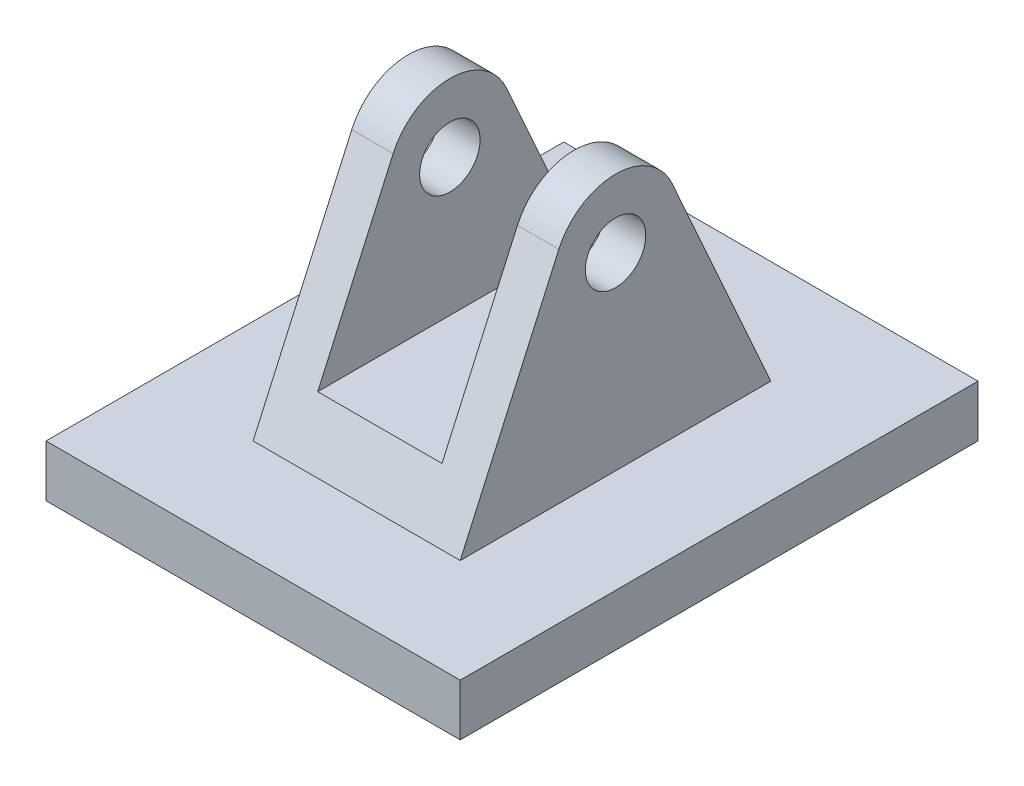
ISO-10303-21;
HEADER;
FILE_DESCRIPTION(('STEP AP214'),'2;1');
FILE_NAME('part.step','',(''),(''),'','','');
FILE_SCHEMA(('AUTOMOTIVE_DESIGN { 1 0 10303 214 1 1 1 1 }'));
ENDSEC;
DATA;
#1=APPLICATION_CONTEXT('core data for automotive mechanical design processes');
#2=APPLICATION_PROTOCOL_DEFINITION('international standard','automotive_design',2000,#1);
#3=PRODUCT_CONTEXT('',#1,'mechanical');
#4=PRODUCT('Part','Part','',(#3));
#5=PRODUCT_RELATED_PRODUCT_CATEGORY('part','',(#4));
#6=PRODUCT_DEFINITION_FORMATION('','',#4);
#7=PRODUCT_DEFINITION_CONTEXT('part definition',#1,'design');
#8=PRODUCT_DEFINITION('design','',#6,#7);
#9=PRODUCT_DEFINITION_SHAPE('','',#8);
#10=(LENGTH_UNIT() NAMED_UNIT(*) SI_UNIT(.MILLI.,.METRE.));
#11=(NAMED_UNIT(*) PLANE_ANGLE_UNIT() SI_UNIT($,.RADIAN.));
#12=(NAMED_UNIT(*) SI_UNIT($,.STERADIAN.) SOLID_ANGLE_UNIT());
#13=UNCERTAINTY_MEASURE_WITH_UNIT(LENGTH_MEASURE(1.E-05),#10,'distance_accuracy_value','');
#14=(GEOMETRIC_REPRESENTATION_CONTEXT(3) GLOBAL_UNCERTAINTY_ASSIGNED_CONTEXT((#13)) GLOBAL_UNIT_ASSIGNED_CONTEXT((#10,
#11,#12)) REPRESENTATION_CONTEXT('',''));
#15=CARTESIAN_POINT('',(0.,0.,0.));
#16=DIRECTION('',(0.,0.,1.));
#17=DIRECTION('',(1.,0.,0.));
#18=AXIS2_PLACEMENT_3D('',#15,#16,#17);
#19=CARTESIAN_POINT('',(-0.0001,47.6360765564273,50.));
#20=DIRECTION('',(1.,0.,0.));
#21=DIRECTION('',(0.,0.,-1.));
#22=AXIS2_PLACEMENT_3D('',#19,#20,#21);
#23=CYLINDRICAL_SURFACE('',#22,12.);
#24=DIRECTION('',(1.,0.,0.));
#25=VECTOR('',#24,1.);
#26=CARTESIAN_POINT('',(-0.0001,52.54005337944,60.9522149047284));
#27=LINE('',#26,#25);
#28=CARTESIAN_POINT('',(28.,52.54005337944,60.9522149047284));
#29=VERTEX_POINT('',#28);
#30=CARTESIAN_POINT('',(19.9999,52.54005337944,60.9522149047284));
#31=VERTEX_POINT('',#30);
#32=EDGE_CURVE('E77',#29,#31,#27,.F.);
#33=ORIENTED_EDGE('',*,*,#32,.F.);
#34=CARTESIAN_POINT('',(28.,47.6360765564273,50.));
#35=DIRECTION('',(1.,0.,0.));
#36=DIRECTION('',(0.,1.,0.));
#37=AXIS2_PLACEMENT_3D('',#34,#35,#36);
#38=CIRCLE('',#37,12.);
#39=CARTESIAN_POINT('',(28.,52.54005337944,39.0477850952716));
#40=VERTEX_POINT('',#39);
#41=EDGE_CURVE('E123',#29,#40,#38,.F.);
#42=ORIENTED_EDGE('',*,*,#41,.T.);
#43=DIRECTION('',(1.,0.,0.));
#44=VECTOR('',#43,1.);
#45=CARTESIAN_POINT('',(-0.0001,52.54005337944,39.0477850952716));
#46=LINE('',#45,#44);
#47=CARTESIAN_POINT('',(19.9999,52.54005337944,39.0477850952716));
#48=VERTEX_POINT('',#47);
#49=EDGE_CURVE('E169',#48,#40,#46,.T.);
#50=ORIENTED_EDGE('',*,*,#49,.F.);
#51=CARTESIAN_POINT('',(19.9999,47.6360765564273,50.));
#52=DIRECTION('',(1.,0.,0.));
#53=DIRECTION('',(0.,0.,-1.));
#54=AXIS2_PLACEMENT_3D('',#51,#52,#53);
#55=CIRCLE('',#54,12.);
#56=EDGE_CURVE('E62',#31,#48,#55,.F.);
#57=ORIENTED_EDGE('',*,*,#56,.F.);
#58=EDGE_LOOP('',(#33,#42,#50,#57));
#59=FACE_BOUND('',#58,.T.);
#60=ADVANCED_FACE('F54',(#59),#23,.T.);
#61=CARTESIAN_POINT('',(79.9999,46.4839000519395,50.));
#62=DIRECTION('',(-1.,0.,0.));
#63=DIRECTION('',(0.,0.,1.));
#64=AXIS2_PLACEMENT_3D('',#61,#62,#63);
#65=CYLINDRICAL_SURFACE('',#64,5.84104382159874);
#66=CARTESIAN_POINT('',(19.9999,46.4839000519395,50.));
#67=DIRECTION('',(-1.,0.,0.));
#68=DIRECTION('',(0.,0.,1.));
#69=AXIS2_PLACEMENT_3D('',#66,#67,#68);
#70=CIRCLE('',#69,5.84104382159874);
#71=CARTESIAN_POINT('',(19.9999,46.4839000519395,55.8410438215987));
#72=VERTEX_POINT('',#71);
#73=EDGE_CURVE('E138',#72,#72,#70,.T.);
#74=ORIENTED_EDGE('',*,*,#73,.T.);
#75=EDGE_LOOP('',(#74));
#76=FACE_BOUND('',#75,.T.);
#77=CARTESIAN_POINT('',(28.,46.4839000519395,50.));
#78=DIRECTION('',(1.,0.,0.));
#79=DIRECTION('',(0.,1.,0.));
#80=AXIS2_PLACEMENT_3D('',#77,#78,#79);
#81=CIRCLE('',#80,5.84104382159874);
#82=CARTESIAN_POINT('',(28.,52.3249438735382,50.));
#83=VERTEX_POINT('',#82);
#84=EDGE_CURVE('E179',#83,#83,#81,.F.);
#85=ORIENTED_EDGE('',*,*,#84,.F.);
#86=EDGE_LOOP('',(#85));
#87=FACE_BOUND('',#86,.T.);
#88=ADVANCED_FACE('F221',(#76,#87),#65,.F.);
#89=CARTESIAN_POINT('',(-0.0001,77.,50.));
#90=DIRECTION('',(0.,0.408664735251059,0.912684575394031));
#91=DIRECTION('',(0.,-0.912684575394031,0.408664735251059));
#92=AXIS2_PLACEMENT_3D('',#89,#90,#91);
#93=PLANE('',#92);
#94=DIRECTION('',(0.,0.912684575394031,-0.408664735251059));
#95=VECTOR('',#94,1.);
#96=CARTESIAN_POINT('',(52.,77.,50.));
#97=LINE('',#96,#95);
#98=CARTESIAN_POINT('',(52.,20.,75.5223880597015));
#99=VERTEX_POINT('',#98);
#100=CARTESIAN_POINT('',(52.,52.54005337944,60.9522149047284));
#101=VERTEX_POINT('',#100);
#102=EDGE_CURVE('E137',#99,#101,#97,.T.);
#103=ORIENTED_EDGE('',*,*,#102,.F.);
#104=DIRECTION('',(-1.,0.,0.));
#105=VECTOR('',#104,1.);
#106=CARTESIAN_POINT('',(-0.0001,20.,75.5223880597015));
#107=LINE('',#106,#105);
#108=CARTESIAN_POINT('',(28.,20.,75.5223880597015));
#109=VERTEX_POINT('',#108);
#110=EDGE_CURVE('E130',#99,#109,#107,.T.);
#111=ORIENTED_EDGE('',*,*,#110,.T.);
#112=DIRECTION('',(0.,0.912684575394031,-0.408664735251059));
#113=VECTOR('',#112,1.);
#114=CARTESIAN_POINT('',(28.,77.,50.));
#115=LINE('',#114,#113);
#116=EDGE_CURVE('E118',#109,#29,#115,.T.);
#117=ORIENTED_EDGE('',*,*,#116,.T.);
#118=ORIENTED_EDGE('',*,*,#32,.T.);
#119=DIRECTION('',(0.,-0.912684575394031,0.408664735251059));
#120=VECTOR('',#119,1.);
#121=CARTESIAN_POINT('',(19.9999,77.,50.));
#122=LINE('',#121,#120);
#123=CARTESIAN_POINT('',(19.9999,10.,80.));
#124=VERTEX_POINT('',#123);
#125=EDGE_CURVE('E155',#31,#124,#122,.T.);
#126=ORIENTED_EDGE('',*,*,#125,.T.);
#127=DIRECTION('',(1.,0.,0.));
#128=VECTOR('',#127,1.);
#129=CARTESIAN_POINT('',(-0.0001,10.,80.));
#130=LINE('',#129,#128);
#131=CARTESIAN_POINT('',(60.,10.,80.));
#132=VERTEX_POINT('',#131);
#133=EDGE_CURVE('E159',#124,#132,#130,.T.);
#134=ORIENTED_EDGE('',*,*,#133,.T.);
#135=DIRECTION('',(0.,-0.912684575394031,0.408664735251059));
#136=VECTOR('',#135,1.);
#137=CARTESIAN_POINT('',(60.,77.,50.));
#138=LINE('',#137,#136);
#139=CARTESIAN_POINT('',(60.,52.54005337944,60.9522149047284));
#140=VERTEX_POINT('',#139);
#141=EDGE_CURVE('E147',#140,#132,#138,.T.);
#142=ORIENTED_EDGE('',*,*,#141,.F.);
#143=EDGE_CURVE('E174',#140,#101,#27,.F.);
#144=ORIENTED_EDGE('',*,*,#143,.T.);
#145=EDGE_LOOP('',(#103,#111,#117,#118,#126,#134,#142,#144));
#146=FACE_BOUND('',#145,.T.);
#147=ADVANCED_FACE('F135',(#146),#93,.T.);
#148=CARTESIAN_POINT('',(-0.0001,10.,20.));
#149=DIRECTION('',(0.,0.408664735251059,-0.912684575394031));
#150=DIRECTION('',(0.,0.912684575394031,0.408664735251059));
#151=AXIS2_PLACEMENT_3D('',#148,#149,#150);
#152=PLANE('',#151);
#153=DIRECTION('',(0.,-0.912684575394031,-0.408664735251059));
#154=VECTOR('',#153,1.);
#155=CARTESIAN_POINT('',(52.,10.,20.));
#156=LINE('',#155,#154);
#157=CARTESIAN_POINT('',(52.,52.54005337944,39.0477850952716));
#158=VERTEX_POINT('',#157);
#159=CARTESIAN_POINT('',(52.,20.,24.4776119402985));
#160=VERTEX_POINT('',#159);
#161=EDGE_CURVE('E143',#158,#160,#156,.T.);
#162=ORIENTED_EDGE('',*,*,#161,.F.);
#163=CARTESIAN_POINT('',(60.,52.54005337944,39.0477850952716));
#164=VERTEX_POINT('',#163);
#165=EDGE_CURVE('E158',#158,#164,#46,.T.);
#166=ORIENTED_EDGE('',*,*,#165,.T.);
#167=DIRECTION('',(0.,0.912684575394031,0.408664735251059));
#168=VECTOR('',#167,1.);
#169=CARTESIAN_POINT('',(60.,10.,20.));
#170=LINE('',#169,#168);
#171=CARTESIAN_POINT('',(60.,10.,20.));
#172=VERTEX_POINT('',#171);
#173=EDGE_CURVE('E152',#172,#164,#170,.T.);
#174=ORIENTED_EDGE('',*,*,#173,.F.);
#175=DIRECTION('',(1.,0.,0.));
#176=VECTOR('',#175,1.);
#177=CARTESIAN_POINT('',(-0.0001,10.,20.));
#178=LINE('',#177,#176);
#179=CARTESIAN_POINT('',(19.9999,10.,20.));
#180=VERTEX_POINT('',#179);
#181=EDGE_CURVE('E156',#180,#172,#178,.T.);
#182=ORIENTED_EDGE('',*,*,#181,.F.);
#183=DIRECTION('',(0.,0.912684575394031,0.408664735251059));
#184=VECTOR('',#183,1.);
#185=CARTESIAN_POINT('',(19.9999,10.,20.));
#186=LINE('',#185,#184);
#187=EDGE_CURVE('E162',#180,#48,#186,.T.);
#188=ORIENTED_EDGE('',*,*,#187,.T.);
#189=ORIENTED_EDGE('',*,*,#49,.T.);
#190=DIRECTION('',(0.,-0.912684575394031,-0.408664735251059));
#191=VECTOR('',#190,1.);
#192=CARTESIAN_POINT('',(28.,10.,20.));
#193=LINE('',#192,#191);
#194=CARTESIAN_POINT('',(28.,20.,24.4776119402985));
#195=VERTEX_POINT('',#194);
#196=EDGE_CURVE('E69',#40,#195,#193,.T.);
#197=ORIENTED_EDGE('',*,*,#196,.T.);
#198=DIRECTION('',(1.,0.,0.));
#199=VECTOR('',#198,1.);
#200=CARTESIAN_POINT('',(-0.0001,20.,24.4776119402985));
#201=LINE('',#200,#199);
#202=EDGE_CURVE('E13',#195,#160,#201,.T.);
#203=ORIENTED_EDGE('',*,*,#202,.T.);
#204=EDGE_LOOP('',(#162,#166,#174,#182,#188,#189,#197,#203));
#205=FACE_BOUND('',#204,.T.);
#206=ADVANCED_FACE('F193',(#205),#152,.T.);
#207=CARTESIAN_POINT('',(-0.0001,10.,80.));
#208=DIRECTION('',(0.,-1.,0.));
#209=DIRECTION('',(0.,0.,-1.));
#210=AXIS2_PLACEMENT_3D('',#207,#208,#209);
#211=PLANE('',#210);
#212=ORIENTED_EDGE('',*,*,#181,.T.);
#213=DIRECTION('',(0.,0.,-1.));
#214=VECTOR('',#213,1.);
#215=CARTESIAN_POINT('',(60.,10.,80.));
#216=LINE('',#215,#214);
#217=EDGE_CURVE('E149',#132,#172,#216,.T.);
#218=ORIENTED_EDGE('',*,*,#217,.F.);
#219=ORIENTED_EDGE('',*,*,#133,.F.);
#220=DIRECTION('',(0.,0.,-1.));
#221=VECTOR('',#220,1.);
#222=CARTESIAN_POINT('',(19.9999,10.,80.));
#223=LINE('',#222,#221);
#224=EDGE_CURVE('E164',#124,#180,#223,.T.);
#225=ORIENTED_EDGE('',*,*,#224,.T.);
#226=EDGE_LOOP('',(#212,#218,#219,#225));
#227=FACE_BOUND('',#226,.T.);
#228=ADVANCED_FACE('F206',(#227),#211,.T.);
#229=CARTESIAN_POINT('',(19.9999,0.,0.));
#230=DIRECTION('',(1.,0.,0.));
#231=DIRECTION('',(0.,0.,-1.));
#232=AXIS2_PLACEMENT_3D('',#229,#230,#231);
#233=PLANE('',#232);
#234=ORIENTED_EDGE('',*,*,#73,.F.);
#235=EDGE_LOOP('',(#234));
#236=FACE_BOUND('',#235,.T.);
#237=ORIENTED_EDGE('',*,*,#125,.F.);
#238=ORIENTED_EDGE('',*,*,#56,.T.);
#239=ORIENTED_EDGE('',*,*,#187,.F.);
#240=ORIENTED_EDGE('',*,*,#224,.F.);
#241=EDGE_LOOP('',(#237,#238,#239,#240));
#242=FACE_BOUND('',#241,.T.);
#243=ADVANCED_FACE('F200',(#236,#242),#233,.F.);
#244=CARTESIAN_POINT('',(60.,0.,0.));
#245=DIRECTION('',(1.,0.,0.));
#246=DIRECTION('',(0.,0.,-1.));
#247=AXIS2_PLACEMENT_3D('',#244,#245,#246);
#248=PLANE('',#247);
#249=CARTESIAN_POINT('',(60.,46.4839000519395,50.));
#250=DIRECTION('',(1.,0.,0.));
#251=DIRECTION('',(0.,0.,-1.));
#252=AXIS2_PLACEMENT_3D('',#249,#250,#251);
#253=CIRCLE('',#252,5.84104382159874);
#254=CARTESIAN_POINT('',(60.,46.4839000519395,55.8410438215987));
#255=VERTEX_POINT('',#254);
#256=EDGE_CURVE('E141',#255,#255,#253,.T.);
#257=ORIENTED_EDGE('',*,*,#256,.F.);
#258=EDGE_LOOP('',(#257));
#259=FACE_BOUND('',#258,.T.);
#260=ORIENTED_EDGE('',*,*,#173,.T.);
#261=CARTESIAN_POINT('',(60.,47.6360765564273,50.));
#262=DIRECTION('',(1.,0.,0.));
#263=DIRECTION('',(0.,0.,-1.));
#264=AXIS2_PLACEMENT_3D('',#261,#262,#263);
#265=CIRCLE('',#264,12.);
#266=EDGE_CURVE('E172',#164,#140,#265,.T.);
#267=ORIENTED_EDGE('',*,*,#266,.T.);
#268=ORIENTED_EDGE('',*,*,#141,.T.);
#269=ORIENTED_EDGE('',*,*,#217,.T.);
#270=EDGE_LOOP('',(#260,#267,#268,#269));
#271=FACE_BOUND('',#270,.T.);
#272=ADVANCED_FACE('F209',(#259,#271),#248,.T.);
#273=CARTESIAN_POINT('',(52.,47.6360765564273,50.));
#274=DIRECTION('',(1.,0.,0.));
#275=DIRECTION('',(0.,0.,-1.));
#276=AXIS2_PLACEMENT_3D('',#273,#274,#275);
#277=CIRCLE('',#276,12.);
#278=EDGE_CURVE('E182',#101,#158,#277,.F.);
#279=ORIENTED_EDGE('',*,*,#278,.F.);
#280=ORIENTED_EDGE('',*,*,#143,.F.);
#281=ORIENTED_EDGE('',*,*,#266,.F.);
#282=ORIENTED_EDGE('',*,*,#165,.F.);
#283=EDGE_LOOP('',(#279,#280,#281,#282));
#284=FACE_BOUND('',#283,.T.);
#285=ADVANCED_FACE('F56',(#284),#23,.T.);
#286=CARTESIAN_POINT('',(52.,46.4839000519395,50.));
#287=DIRECTION('',(1.,0.,0.));
#288=DIRECTION('',(0.,0.,-1.));
#289=AXIS2_PLACEMENT_3D('',#286,#287,#288);
#290=CIRCLE('',#289,5.84104382159874);
#291=CARTESIAN_POINT('',(52.,46.4839000519395,55.8410438215987));
#292=VERTEX_POINT('',#291);
#293=EDGE_CURVE('E125',#292,#292,#290,.F.);
#294=CARTESIAN_POINT('',(52.,46.4839000519395,55.8410438215987));
#295=CARTESIAN_POINT('',(52.0833333333333,46.4839000519395,55.8410438215987));
#296=CARTESIAN_POINT('',(52.1666666666667,46.4839000519395,55.8410438215987));
#297=CARTESIAN_POINT('',(52.3333333333333,46.4839000519395,55.8410438215987));
#298=CARTESIAN_POINT('',(52.4166666666667,46.4839000519395,55.8410438215987));
#299=CARTESIAN_POINT('',(52.5833333333333,46.4839000519395,55.8410438215987));
#300=CARTESIAN_POINT('',(52.6666666666667,46.4839000519395,55.8410438215987));
#301=CARTESIAN_POINT('',(52.8333333333333,46.4839000519395,55.8410438215987));
#302=CARTESIAN_POINT('',(52.9166666666667,46.4839000519395,55.8410438215987));
#303=CARTESIAN_POINT('',(53.0833333333333,46.4839000519395,55.8410438215987));
#304=CARTESIAN_POINT('',(53.1666666666667,46.4839000519395,55.8410438215987));
#305=CARTESIAN_POINT('',(53.3333333333333,46.4839000519395,55.8410438215987));
#306=CARTESIAN_POINT('',(53.4166666666667,46.4839000519395,55.8410438215987));
#307=CARTESIAN_POINT('',(53.5833333333333,46.4839000519395,55.8410438215987));
#308=CARTESIAN_POINT('',(53.6666666666667,46.4839000519395,55.8410438215987));
#309=CARTESIAN_POINT('',(53.8333333333333,46.4839000519395,55.8410438215987));
#310=CARTESIAN_POINT('',(53.9166666666667,46.4839000519395,55.8410438215987));
#311=CARTESIAN_POINT('',(54.0833333333333,46.4839000519395,55.8410438215987));
#312=CARTESIAN_POINT('',(54.1666666666667,46.4839000519395,55.8410438215987));
#313=CARTESIAN_POINT('',(54.3333333333333,46.4839000519395,55.8410438215987));
#314=CARTESIAN_POINT('',(54.4166666666667,46.4839000519395,55.8410438215987));
#315=CARTESIAN_POINT('',(54.5833333333333,46.4839000519395,55.8410438215987));
#316=CARTESIAN_POINT('',(54.6666666666667,46.4839000519395,55.8410438215987));
#317=CARTESIAN_POINT('',(54.8333333333333,46.4839000519395,55.8410438215987));
#318=CARTESIAN_POINT('',(54.9166666666667,46.4839000519395,55.8410438215987));
#319=CARTESIAN_POINT('',(55.0833333333333,46.4839000519395,55.8410438215987));
#320=CARTESIAN_POINT('',(55.1666666666667,46.4839000519395,55.8410438215987));
#321=CARTESIAN_POINT('',(55.3333333333333,46.4839000519395,55.8410438215987));
#322=CARTESIAN_POINT('',(55.4166666666667,46.4839000519395,55.8410438215987));
#323=CARTESIAN_POINT('',(55.5833333333333,46.4839000519395,55.8410438215987));
#324=CARTESIAN_POINT('',(55.6666666666667,46.4839000519395,55.8410438215987));
#325=CARTESIAN_POINT('',(55.8333333333333,46.4839000519395,55.8410438215987));
#326=CARTESIAN_POINT('',(55.9166666666667,46.4839000519395,55.8410438215987));
#327=CARTESIAN_POINT('',(56.0833333333333,46.4839000519395,55.8410438215987));
#328=CARTESIAN_POINT('',(56.1666666666667,46.4839000519395,55.8410438215987));
#329=CARTESIAN_POINT('',(56.3333333333333,46.4839000519395,55.8410438215987));
#330=CARTESIAN_POINT('',(56.4166666666667,46.4839000519395,55.8410438215987));
#331=CARTESIAN_POINT('',(56.5833333333333,46.4839000519395,55.8410438215987));
#332=CARTESIAN_POINT('',(56.6666666666667,46.4839000519395,55.8410438215987));
#333=CARTESIAN_POINT('',(56.8333333333333,46.4839000519395,55.8410438215987));
#334=CARTESIAN_POINT('',(56.9166666666667,46.4839000519395,55.8410438215987));
#335=CARTESIAN_POINT('',(57.0833333333333,46.4839000519395,55.8410438215987));
#336=CARTESIAN_POINT('',(57.1666666666667,46.4839000519395,55.8410438215987));
#337=CARTESIAN_POINT('',(57.3333333333333,46.4839000519395,55.8410438215987));
#338=CARTESIAN_POINT('',(57.4166666666667,46.4839000519395,55.8410438215987));
#339=CARTESIAN_POINT('',(57.5833333333333,46.4839000519395,55.8410438215987));
#340=CARTESIAN_POINT('',(57.6666666666667,46.4839000519395,55.8410438215987));
#341=CARTESIAN_POINT('',(57.8333333333333,46.4839000519395,55.8410438215987));
#342=CARTESIAN_POINT('',(57.9166666666667,46.4839000519395,55.8410438215987));
#343=CARTESIAN_POINT('',(58.0833333333333,46.4839000519395,55.8410438215987));
#344=CARTESIAN_POINT('',(58.1666666666667,46.4839000519395,55.8410438215987));
#345=CARTESIAN_POINT('',(58.3333333333333,46.4839000519395,55.8410438215987));
#346=CARTESIAN_POINT('',(58.4166666666667,46.4839000519395,55.8410438215987));
#347=CARTESIAN_POINT('',(58.5833333333333,46.4839000519395,55.8410438215987));
#348=CARTESIAN_POINT('',(58.6666666666667,46.4839000519395,55.8410438215987));
#349=CARTESIAN_POINT('',(58.8333333333333,46.4839000519395,55.8410438215987));
#350=CARTESIAN_POINT('',(58.9166666666667,46.4839000519395,55.8410438215987));
#351=CARTESIAN_POINT('',(59.0833333333333,46.4839000519395,55.8410438215987));
#352=CARTESIAN_POINT('',(59.1666666666667,46.4839000519395,55.8410438215987));
#353=CARTESIAN_POINT('',(59.3333333333333,46.4839000519395,55.8410438215987));
#354=CARTESIAN_POINT('',(59.4166666666667,46.4839000519395,55.8410438215987));
#355=CARTESIAN_POINT('',(59.5833333333333,46.4839000519395,55.8410438215987));
#356=CARTESIAN_POINT('',(59.6666666666667,46.4839000519395,55.8410438215987));
#357=CARTESIAN_POINT('',(59.8333333333333,46.4839000519395,55.8410438215987));
#358=CARTESIAN_POINT('',(59.9166666666667,46.4839000519395,55.8410438215987));
#359=CARTESIAN_POINT('',(60.,46.4839000519395,55.8410438215987));
#360=B_SPLINE_CURVE_WITH_KNOTS('',3,(#294,#295,#296,#297,#298,#299,#300,#301,#302,#303,#304,
#305,#306,#307,#308,#309,#310,#311,#312,#313,#314,#315,#316,#317,#318,#319,#320,#321,#322,#323,
#324,#325,#326,#327,#328,#329,#330,#331,#332,#333,#334,#335,#336,#337,#338,#339,#340,#341,#342,
#343,#344,#345,#346,#347,#348,#349,#350,#351,#352,#353,#354,#355,#356,#357,#358,#359),
.UNSPECIFIED.,.F.,.F.,(4,2,2,2,2,2,2,2,2,2,2,2,2,2,2,2,2,2,2,2,2,2,2,2,2,2,2,2,2,2,2,2,4),(0.,
0.25,0.5,0.750000000000001,1.,1.25,1.5,1.75,2.,2.25,2.5,2.75,3.,3.25,3.5,3.75,4.,4.25,4.5,4.75,
5.,5.25,5.50000000000001,5.75000000000001,6.00000000000001,6.25000000000001,6.50000000000001,
6.75000000000001,7.00000000000001,7.25000000000001,7.50000000000001,7.75000000000001,
8.00000000000001),.UNSPECIFIED.);
#361=EDGE_CURVE('BSEAM214',#292,#255,#360,.T.);
#362=ORIENTED_EDGE('',*,*,#293,.T.);
#363=ORIENTED_EDGE('',*,*,#256,.T.);
#364=ORIENTED_EDGE('',*,*,#361,.T.);
#365=ORIENTED_EDGE('',*,*,#361,.F.);
#366=EDGE_LOOP('',(#362,#364,#363,#365));
#367=FACE_BOUND('',#366,.T.);
#368=ADVANCED_FACE('F214',(#367),#65,.F.);
#369=CARTESIAN_POINT('',(52.,66.5130853694821,200.));
#370=DIRECTION('',(1.,0.,0.));
#371=DIRECTION('',(0.,0.,-1.));
#372=AXIS2_PLACEMENT_3D('',#369,#370,#371);
#373=PLANE('',#372);
#374=ORIENTED_EDGE('',*,*,#102,.T.);
#375=ORIENTED_EDGE('',*,*,#278,.T.);
#376=ORIENTED_EDGE('',*,*,#161,.T.);
#377=DIRECTION('',(0.,0.,-1.));
#378=VECTOR('',#377,1.);
#379=CARTESIAN_POINT('',(52.,20.,200.));
#380=LINE('',#379,#378);
#381=EDGE_CURVE('E132',#99,#160,#380,.T.);
#382=ORIENTED_EDGE('',*,*,#381,.F.);
#383=EDGE_LOOP('',(#374,#375,#376,#382));
#384=FACE_BOUND('',#383,.T.);
#385=ORIENTED_EDGE('',*,*,#293,.F.);
#386=EDGE_LOOP('',(#385));
#387=FACE_BOUND('',#386,.T.);
#388=ADVANCED_FACE('F219',(#384,#387),#373,.F.);
#389=CARTESIAN_POINT('',(28.,66.5130853694821,200.));
#390=DIRECTION('',(1.,0.,0.));
#391=DIRECTION('',(0.,1.,0.));
#392=AXIS2_PLACEMENT_3D('',#389,#390,#391);
#393=PLANE('',#392);
#394=DIRECTION('',(0.,0.,-1.));
#395=VECTOR('',#394,1.);
#396=CARTESIAN_POINT('',(28.,20.,200.));
#397=LINE('',#396,#395);
#398=EDGE_CURVE('E122',#109,#195,#397,.T.);
#399=ORIENTED_EDGE('',*,*,#398,.T.);
#400=ORIENTED_EDGE('',*,*,#196,.F.);
#401=ORIENTED_EDGE('',*,*,#41,.F.);
#402=ORIENTED_EDGE('',*,*,#116,.F.);
#403=EDGE_LOOP('',(#399,#400,#401,#402));
#404=FACE_BOUND('',#403,.T.);
#405=ORIENTED_EDGE('',*,*,#84,.T.);
#406=EDGE_LOOP('',(#405));
#407=FACE_BOUND('',#406,.T.);
#408=ADVANCED_FACE('F120',(#404,#407),#393,.T.);
#409=CARTESIAN_POINT('',(28.,20.,200.));
#410=DIRECTION('',(0.,1.,0.));
#411=DIRECTION('',(0.,0.,1.));
#412=AXIS2_PLACEMENT_3D('',#409,#410,#411);
#413=PLANE('',#412);
#414=ORIENTED_EDGE('',*,*,#381,.T.);
#415=ORIENTED_EDGE('',*,*,#202,.F.);
#416=ORIENTED_EDGE('',*,*,#398,.F.);
#417=ORIENTED_EDGE('',*,*,#110,.F.);
#418=EDGE_LOOP('',(#414,#415,#416,#417));
#419=FACE_BOUND('',#418,.T.);
#420=ADVANCED_FACE('F129',(#419),#413,.T.);
#421=CLOSED_SHELL('',(#60,#88,#147,#206,#228,#243,#272,#285,#368,#388,#408,#420));
#422=MANIFOLD_SOLID_BREP('B2',#421);
#423=CARTESIAN_POINT('',(0.,10.,0.));
#424=DIRECTION('',(1.,0.,0.));
#425=DIRECTION('',(0.,0.,-1.));
#426=AXIS2_PLACEMENT_3D('',#423,#424,#425);
#427=PLANE('',#426);
#428=DIRECTION('',(0.,0.,1.));
#429=VECTOR('',#428,1.);
#430=CARTESIAN_POINT('',(0.,0.,0.));
#431=LINE('',#430,#429);
#432=CARTESIAN_POINT('',(0.,0.,0.));
#433=VERTEX_POINT('',#432);
#434=CARTESIAN_POINT('',(0.,0.,100.));
#435=VERTEX_POINT('',#434);
#436=EDGE_CURVE('E383',#433,#435,#431,.T.);
#437=ORIENTED_EDGE('',*,*,#436,.T.);
#438=DIRECTION('',(0.,-1.,0.));
#439=VECTOR('',#438,1.);
#440=CARTESIAN_POINT('',(0.,10.,100.));
#441=LINE('',#440,#439);
#442=CARTESIAN_POINT('',(0.,10.,100.));
#443=VERTEX_POINT('',#442);
#444=EDGE_CURVE('E52',#443,#435,#441,.T.);
#445=ORIENTED_EDGE('',*,*,#444,.F.);
#446=DIRECTION('',(0.,0.,1.));
#447=VECTOR('',#446,1.);
#448=CARTESIAN_POINT('',(0.,10.,0.));
#449=LINE('',#448,#447);
#450=CARTESIAN_POINT('',(0.,10.,0.));
#451=VERTEX_POINT('',#450);
#452=EDGE_CURVE('E371',#451,#443,#449,.T.);
#453=ORIENTED_EDGE('',*,*,#452,.F.);
#454=DIRECTION('',(0.,-1.,0.));
#455=VECTOR('',#454,1.);
#456=CARTESIAN_POINT('',(0.,10.,0.));
#457=LINE('',#456,#455);
#458=EDGE_CURVE('E379',#451,#433,#457,.T.);
#459=ORIENTED_EDGE('',*,*,#458,.T.);
#460=EDGE_LOOP('',(#437,#445,#453,#459));
#461=FACE_BOUND('',#460,.T.);
#462=ADVANCED_FACE('F320',(#461),#427,.F.);
#463=CARTESIAN_POINT('',(0.,10.,100.));
#464=DIRECTION('',(0.,0.,-1.));
#465=DIRECTION('',(-1.,0.,0.));
#466=AXIS2_PLACEMENT_3D('',#463,#464,#465);
#467=PLANE('',#466);
#468=DIRECTION('',(1.,0.,0.));
#469=VECTOR('',#468,1.);
#470=CARTESIAN_POINT('',(0.,0.,100.));
#471=LINE('',#470,#469);
#472=CARTESIAN_POINT('',(80.,0.,100.));
#473=VERTEX_POINT('',#472);
#474=EDGE_CURVE('E375',#435,#473,#471,.T.);
#475=ORIENTED_EDGE('',*,*,#474,.T.);
#476=DIRECTION('',(0.,-1.,0.));
#477=VECTOR('',#476,1.);
#478=CARTESIAN_POINT('',(80.,10.,100.));
#479=LINE('',#478,#477);
#480=CARTESIAN_POINT('',(80.,10.,100.));
#481=VERTEX_POINT('',#480);
#482=EDGE_CURVE('E328',#481,#473,#479,.T.);
#483=ORIENTED_EDGE('',*,*,#482,.F.);
#484=DIRECTION('',(1.,0.,0.));
#485=VECTOR('',#484,1.);
#486=CARTESIAN_POINT('',(0.,10.,100.));
#487=LINE('',#486,#485);
#488=EDGE_CURVE('E366',#443,#481,#487,.T.);
#489=ORIENTED_EDGE('',*,*,#488,.F.);
#490=ORIENTED_EDGE('',*,*,#444,.T.);
#491=EDGE_LOOP('',(#475,#483,#489,#490));
#492=FACE_BOUND('',#491,.T.);
#493=ADVANCED_FACE('F374',(#492),#467,.F.);
#494=CARTESIAN_POINT('',(80.,10.,0.));
#495=DIRECTION('',(-1.,0.,0.));
#496=DIRECTION('',(0.,0.,1.));
#497=AXIS2_PLACEMENT_3D('',#494,#495,#496);
#498=PLANE('',#497);
#499=DIRECTION('',(0.,0.,-1.));
#500=VECTOR('',#499,1.);
#501=CARTESIAN_POINT('',(80.,0.,0.));
#502=LINE('',#501,#500);
#503=CARTESIAN_POINT('',(80.,0.,0.));
#504=VERTEX_POINT('',#503);
#505=EDGE_CURVE('E353',#473,#504,#502,.T.);
#506=ORIENTED_EDGE('',*,*,#505,.T.);
#507=DIRECTION('',(0.,-1.,0.));
#508=VECTOR('',#507,1.);
#509=CARTESIAN_POINT('',(80.,10.,0.));
#510=LINE('',#509,#508);
#511=CARTESIAN_POINT('',(80.,10.,0.));
#512=VERTEX_POINT('',#511);
#513=EDGE_CURVE('E376',#512,#504,#510,.T.);
#514=ORIENTED_EDGE('',*,*,#513,.F.);
#515=DIRECTION('',(0.,0.,-1.));
#516=VECTOR('',#515,1.);
#517=CARTESIAN_POINT('',(80.,10.,0.));
#518=LINE('',#517,#516);
#519=EDGE_CURVE('E369',#481,#512,#518,.T.);
#520=ORIENTED_EDGE('',*,*,#519,.F.);
#521=ORIENTED_EDGE('',*,*,#482,.T.);
#522=EDGE_LOOP('',(#506,#514,#520,#521));
#523=FACE_BOUND('',#522,.T.);
#524=ADVANCED_FACE('F377',(#523),#498,.F.);
#525=CARTESIAN_POINT('',(0.,10.,0.));
#526=DIRECTION('',(0.,0.,1.));
#527=DIRECTION('',(1.,0.,0.));
#528=AXIS2_PLACEMENT_3D('',#525,#526,#527);
#529=PLANE('',#528);
#530=DIRECTION('',(-1.,0.,0.));
#531=VECTOR('',#530,1.);
#532=CARTESIAN_POINT('',(0.,0.,0.));
#533=LINE('',#532,#531);
#534=EDGE_CURVE('E359',#504,#433,#533,.T.);
#535=ORIENTED_EDGE('',*,*,#534,.T.);
#536=ORIENTED_EDGE('',*,*,#458,.F.);
#537=DIRECTION('',(-1.,0.,0.));
#538=VECTOR('',#537,1.);
#539=CARTESIAN_POINT('',(0.,10.,0.));
#540=LINE('',#539,#538);
#541=EDGE_CURVE('E336',#512,#451,#540,.T.);
#542=ORIENTED_EDGE('',*,*,#541,.F.);
#543=ORIENTED_EDGE('',*,*,#513,.T.);
#544=EDGE_LOOP('',(#535,#536,#542,#543));
#545=FACE_BOUND('',#544,.T.);
#546=ADVANCED_FACE('F390',(#545),#529,.F.);
#547=CARTESIAN_POINT('',(0.,10.,0.));
#548=DIRECTION('',(0.,1.,0.));
#549=DIRECTION('',(0.,0.,1.));
#550=AXIS2_PLACEMENT_3D('',#547,#548,#549);
#551=PLANE('',#550);
#552=ORIENTED_EDGE('',*,*,#452,.T.);
#553=ORIENTED_EDGE('',*,*,#488,.T.);
#554=ORIENTED_EDGE('',*,*,#519,.T.);
#555=ORIENTED_EDGE('',*,*,#541,.T.);
#556=EDGE_LOOP('',(#552,#553,#554,#555));
#557=FACE_BOUND('',#556,.T.);
#558=ADVANCED_FACE('F367',(#557),#551,.T.);
#559=CARTESIAN_POINT('',(0.,0.,0.));
#560=DIRECTION('',(0.,1.,0.));
#561=DIRECTION('',(0.,0.,1.));
#562=AXIS2_PLACEMENT_3D('',#559,#560,#561);
#563=PLANE('',#562);
#564=ORIENTED_EDGE('',*,*,#436,.F.);
#565=ORIENTED_EDGE('',*,*,#534,.F.);
#566=ORIENTED_EDGE('',*,*,#505,.F.);
#567=ORIENTED_EDGE('',*,*,#474,.F.);
#568=EDGE_LOOP('',(#564,#565,#566,#567));
#569=FACE_BOUND('',#568,.T.);
#570=ADVANCED_FACE('F393',(#569),#563,.F.);
#571=CLOSED_SHELL('',(#462,#493,#524,#546,#558,#570));
#572=MANIFOLD_SOLID_BREP('B7',#571);
#573=ADVANCED_BREP_SHAPE_REPRESENTATION('',(#18,#422,#572),#14);
#574=SHAPE_DEFINITION_REPRESENTATION(#9,#573);
ENDSEC;
END-ISO-10303-21;
